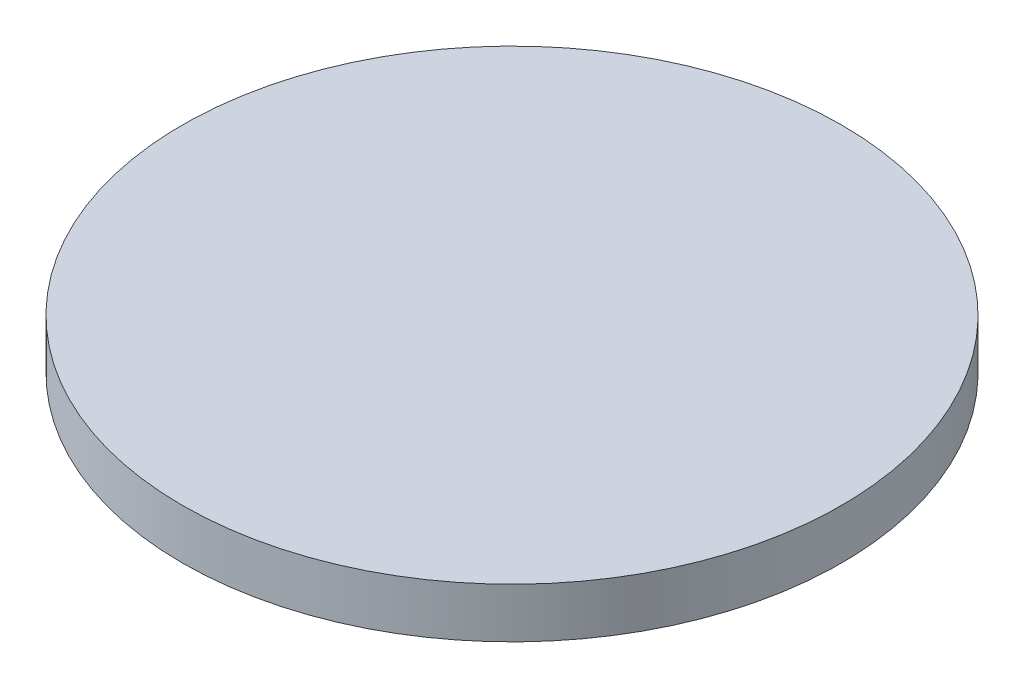
ISO-10303-21;
HEADER;
FILE_DESCRIPTION(('STEP AP214'),'2;1');
FILE_NAME('part.step','',(''),(''),'','','');
FILE_SCHEMA(('AUTOMOTIVE_DESIGN { 1 0 10303 214 1 1 1 1 }'));
ENDSEC;
DATA;
#1=APPLICATION_CONTEXT('core data for automotive mechanical design processes');
#2=APPLICATION_PROTOCOL_DEFINITION('international standard','automotive_design',2000,#1);
#3=PRODUCT_CONTEXT('',#1,'mechanical');
#4=PRODUCT('Part','Part','',(#3));
#5=PRODUCT_RELATED_PRODUCT_CATEGORY('part','',(#4));
#6=PRODUCT_DEFINITION_FORMATION('','',#4);
#7=PRODUCT_DEFINITION_CONTEXT('part definition',#1,'design');
#8=PRODUCT_DEFINITION('design','',#6,#7);
#9=PRODUCT_DEFINITION_SHAPE('','',#8);
#10=(LENGTH_UNIT() NAMED_UNIT(*) SI_UNIT(.MILLI.,.METRE.));
#11=(NAMED_UNIT(*) PLANE_ANGLE_UNIT() SI_UNIT($,.RADIAN.));
#12=(NAMED_UNIT(*) SI_UNIT($,.STERADIAN.) SOLID_ANGLE_UNIT());
#13=UNCERTAINTY_MEASURE_WITH_UNIT(LENGTH_MEASURE(1.E-05),#10,'distance_accuracy_value','');
#14=(GEOMETRIC_REPRESENTATION_CONTEXT(3) GLOBAL_UNCERTAINTY_ASSIGNED_CONTEXT((#13)) GLOBAL_UNIT_ASSIGNED_CONTEXT((#10,
#11,#12)) REPRESENTATION_CONTEXT('',''));
#15=CARTESIAN_POINT('',(0.,0.,0.));
#16=DIRECTION('',(0.,0.,1.));
#17=DIRECTION('',(1.,0.,0.));
#18=AXIS2_PLACEMENT_3D('',#15,#16,#17);
#19=CARTESIAN_POINT('',(0.,0.,0.));
#20=DIRECTION('',(0.,-1.,0.));
#21=DIRECTION('',(0.,0.,-1.));
#22=AXIS2_PLACEMENT_3D('',#19,#20,#21);
#23=PLANE('',#22);
#24=CARTESIAN_POINT('',(63.8175,0.,-63.8175));
#25=DIRECTION('',(0.,-1.,0.));
#26=DIRECTION('',(0.,0.,-1.));
#27=AXIS2_PLACEMENT_3D('',#24,#25,#26);
#28=CIRCLE('',#27,83.82);
#29=CARTESIAN_POINT('',(63.8175,0.,-147.6375));
#30=VERTEX_POINT('',#29);
#31=EDGE_CURVE('E11',#30,#30,#28,.T.);
#32=ORIENTED_EDGE('',*,*,#31,.T.);
#33=EDGE_LOOP('',(#32));
#34=FACE_BOUND('',#33,.T.);
#35=ADVANCED_FACE('F45',(#34),#23,.T.);
#36=CARTESIAN_POINT('',(63.8175,-154.94,-63.8175));
#37=DIRECTION('',(0.,1.,0.));
#38=DIRECTION('',(0.,0.,1.));
#39=AXIS2_PLACEMENT_3D('',#36,#37,#38);
#40=CYLINDRICAL_SURFACE('',#39,83.82);
#41=ORIENTED_EDGE('',*,*,#31,.F.);
#42=EDGE_LOOP('',(#41));
#43=FACE_BOUND('',#42,.T.);
#44=CARTESIAN_POINT('',(63.8175,12.7,-63.8175));
#45=DIRECTION('',(0.,1.,0.));
#46=DIRECTION('',(0.,0.,1.));
#47=AXIS2_PLACEMENT_3D('',#44,#45,#46);
#48=CIRCLE('',#47,83.82);
#49=CARTESIAN_POINT('',(63.8175,12.7,20.0025));
#50=VERTEX_POINT('',#49);
#51=EDGE_CURVE('E52',#50,#50,#48,.T.);
#52=ORIENTED_EDGE('',*,*,#51,.F.);
#53=EDGE_LOOP('',(#52));
#54=FACE_BOUND('',#53,.T.);
#55=ADVANCED_FACE('F61',(#43,#54),#40,.T.);
#56=CARTESIAN_POINT('',(0.,12.7,0.));
#57=DIRECTION('',(0.,-1.,0.));
#58=DIRECTION('',(0.,0.,-1.));
#59=AXIS2_PLACEMENT_3D('',#56,#57,#58);
#60=PLANE('',#59);
#61=ORIENTED_EDGE('',*,*,#51,.T.);
#62=EDGE_LOOP('',(#61));
#63=FACE_BOUND('',#62,.T.);
#64=ADVANCED_FACE('F59',(#63),#60,.F.);
#65=CLOSED_SHELL('',(#35,#55,#64));
#66=MANIFOLD_SOLID_BREP('B2',#65);
#67=ADVANCED_BREP_SHAPE_REPRESENTATION('',(#18,#66),#14);
#68=SHAPE_DEFINITION_REPRESENTATION(#9,#67);
ENDSEC;
END-ISO-10303-21;
